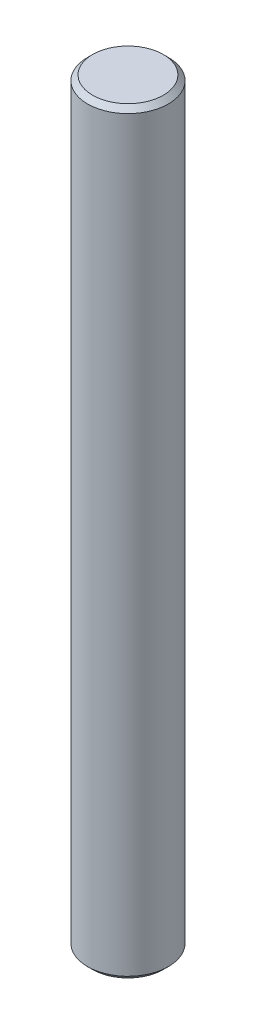
ISO-10303-21;
HEADER;
FILE_DESCRIPTION(('STEP AP214'),'2;1');
FILE_NAME('part.step','',(''),(''),'','','');
FILE_SCHEMA(('AUTOMOTIVE_DESIGN { 1 0 10303 214 1 1 1 1 }'));
ENDSEC;
DATA;
#1=APPLICATION_CONTEXT('core data for automotive mechanical design processes');
#2=APPLICATION_PROTOCOL_DEFINITION('international standard','automotive_design',2000,#1);
#3=PRODUCT_CONTEXT('',#1,'mechanical');
#4=PRODUCT('Part','Part','',(#3));
#5=PRODUCT_RELATED_PRODUCT_CATEGORY('part','',(#4));
#6=PRODUCT_DEFINITION_FORMATION('','',#4);
#7=PRODUCT_DEFINITION_CONTEXT('part definition',#1,'design');
#8=PRODUCT_DEFINITION('design','',#6,#7);
#9=PRODUCT_DEFINITION_SHAPE('','',#8);
#10=(LENGTH_UNIT() NAMED_UNIT(*) SI_UNIT(.MILLI.,.METRE.));
#11=(NAMED_UNIT(*) PLANE_ANGLE_UNIT() SI_UNIT($,.RADIAN.));
#12=(NAMED_UNIT(*) SI_UNIT($,.STERADIAN.) SOLID_ANGLE_UNIT());
#13=UNCERTAINTY_MEASURE_WITH_UNIT(LENGTH_MEASURE(1.E-05),#10,'distance_accuracy_value','');
#14=(GEOMETRIC_REPRESENTATION_CONTEXT(3) GLOBAL_UNCERTAINTY_ASSIGNED_CONTEXT((#13)) GLOBAL_UNIT_ASSIGNED_CONTEXT((#10,
#11,#12)) REPRESENTATION_CONTEXT('',''));
#15=CARTESIAN_POINT('',(0.,0.,0.));
#16=DIRECTION('',(0.,0.,1.));
#17=DIRECTION('',(1.,0.,0.));
#18=AXIS2_PLACEMENT_3D('',#15,#16,#17);
#19=CARTESIAN_POINT('',(0.,37.5,0.));
#20=DIRECTION('',(0.,-1.,0.));
#21=DIRECTION('',(0.,0.,-1.));
#22=AXIS2_PLACEMENT_3D('',#19,#20,#21);
#23=CYLINDRICAL_SURFACE('',#22,4.);
#24=CARTESIAN_POINT('',(0.,-37.,0.));
#25=DIRECTION('',(0.,1.,0.));
#26=DIRECTION('',(0.,0.,1.));
#27=AXIS2_PLACEMENT_3D('',#24,#25,#26);
#28=CIRCLE('',#27,4.);
#29=CARTESIAN_POINT('',(0.,-37.,4.));
#30=VERTEX_POINT('',#29);
#31=EDGE_CURVE('E49',#30,#30,#28,.T.);
#32=ORIENTED_EDGE('',*,*,#31,.T.);
#33=EDGE_LOOP('',(#32));
#34=FACE_BOUND('',#33,.T.);
#35=CARTESIAN_POINT('',(0.,37.,0.));
#36=DIRECTION('',(0.,1.,0.));
#37=DIRECTION('',(0.,0.,1.));
#38=AXIS2_PLACEMENT_3D('',#35,#36,#37);
#39=CIRCLE('',#38,4.);
#40=CARTESIAN_POINT('',(0.,37.,4.));
#41=VERTEX_POINT('',#40);
#42=EDGE_CURVE('E53',#41,#41,#39,.F.);
#43=ORIENTED_EDGE('',*,*,#42,.T.);
#44=EDGE_LOOP('',(#43));
#45=FACE_BOUND('',#44,.T.);
#46=ADVANCED_FACE('F37',(#34,#45),#23,.T.);
#47=CARTESIAN_POINT('',(0.,37.5,0.));
#48=DIRECTION('',(0.,1.,0.));
#49=DIRECTION('',(0.,0.,1.));
#50=AXIS2_PLACEMENT_3D('',#47,#48,#49);
#51=PLANE('',#50);
#52=CARTESIAN_POINT('',(0.,37.5,0.));
#53=DIRECTION('',(0.,1.,0.));
#54=DIRECTION('',(0.,0.,1.));
#55=AXIS2_PLACEMENT_3D('',#52,#53,#54);
#56=CIRCLE('',#55,3.5);
#57=CARTESIAN_POINT('',(0.,37.5,3.5));
#58=VERTEX_POINT('',#57);
#59=EDGE_CURVE('E10',#58,#58,#56,.T.);
#60=ORIENTED_EDGE('',*,*,#59,.T.);
#61=EDGE_LOOP('',(#60));
#62=FACE_BOUND('',#61,.T.);
#63=ADVANCED_FACE('F69',(#62),#51,.T.);
#64=CARTESIAN_POINT('',(0.,-37.5,0.));
#65=DIRECTION('',(0.,1.,0.));
#66=DIRECTION('',(0.,0.,1.));
#67=AXIS2_PLACEMENT_3D('',#64,#65,#66);
#68=PLANE('',#67);
#69=CARTESIAN_POINT('',(0.,-37.5,0.));
#70=DIRECTION('',(0.,1.,0.));
#71=DIRECTION('',(0.,0.,1.));
#72=AXIS2_PLACEMENT_3D('',#69,#70,#71);
#73=CIRCLE('',#72,3.49999999999999);
#74=CARTESIAN_POINT('',(0.,-37.5,3.49999999999999));
#75=VERTEX_POINT('',#74);
#76=EDGE_CURVE('E45',#75,#75,#73,.F.);
#77=ORIENTED_EDGE('',*,*,#76,.T.);
#78=EDGE_LOOP('',(#77));
#79=FACE_BOUND('',#78,.T.);
#80=ADVANCED_FACE('F66',(#79),#68,.F.);
#81=CARTESIAN_POINT('',(0.,-37.,0.));
#82=DIRECTION('',(0.,1.,0.));
#83=DIRECTION('',(0.,0.,1.));
#84=AXIS2_PLACEMENT_3D('',#81,#82,#83);
#85=CONICAL_SURFACE('',#84,4.,0.785398163397444);
#86=ORIENTED_EDGE('',*,*,#76,.F.);
#87=EDGE_LOOP('',(#86));
#88=FACE_BOUND('',#87,.T.);
#89=ORIENTED_EDGE('',*,*,#31,.F.);
#90=EDGE_LOOP('',(#89));
#91=FACE_BOUND('',#90,.T.);
#92=ADVANCED_FACE('F62',(#88,#91),#85,.T.);
#93=CARTESIAN_POINT('',(0.,37.5,0.));
#94=DIRECTION('',(0.,-1.,0.));
#95=DIRECTION('',(0.,0.,-1.));
#96=AXIS2_PLACEMENT_3D('',#93,#94,#95);
#97=CONICAL_SURFACE('',#96,3.5,0.785398163397451);
#98=ORIENTED_EDGE('',*,*,#42,.F.);
#99=EDGE_LOOP('',(#98));
#100=FACE_BOUND('',#99,.T.);
#101=ORIENTED_EDGE('',*,*,#59,.F.);
#102=EDGE_LOOP('',(#101));
#103=FACE_BOUND('',#102,.T.);
#104=ADVANCED_FACE('F40',(#100,#103),#97,.T.);
#105=CLOSED_SHELL('',(#46,#63,#80,#92,#104));
#106=MANIFOLD_SOLID_BREP('B2',#105);
#107=ADVANCED_BREP_SHAPE_REPRESENTATION('',(#18,#106),#14);
#108=SHAPE_DEFINITION_REPRESENTATION(#9,#107);
ENDSEC;
END-ISO-10303-21;
